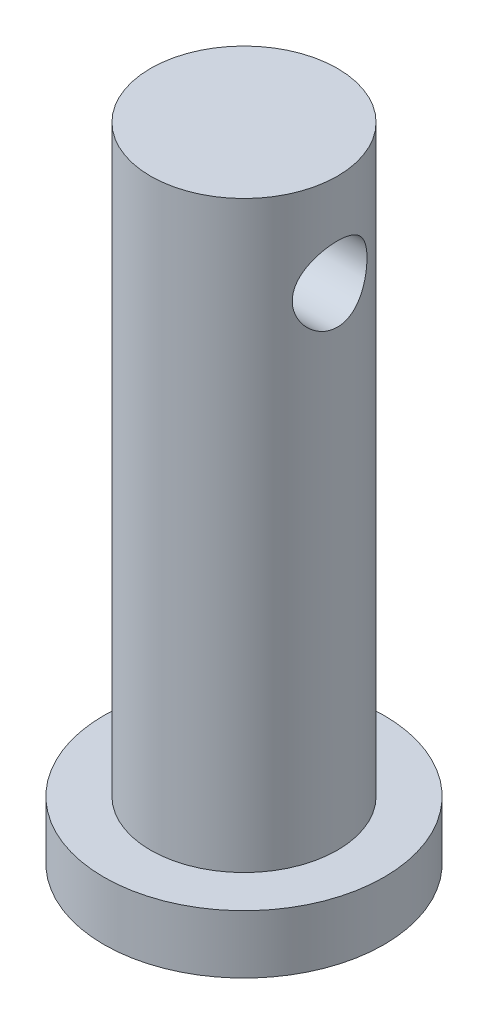
ISO-10303-21;
HEADER;
FILE_DESCRIPTION(('STEP AP214'),'2;1');
FILE_NAME('part.step','',(''),(''),'','','');
FILE_SCHEMA(('AUTOMOTIVE_DESIGN { 1 0 10303 214 1 1 1 1 }'));
ENDSEC;
DATA;
#1=APPLICATION_CONTEXT('core data for automotive mechanical design processes');
#2=APPLICATION_PROTOCOL_DEFINITION('international standard','automotive_design',2000,#1);
#3=PRODUCT_CONTEXT('',#1,'mechanical');
#4=PRODUCT('Part','Part','',(#3));
#5=PRODUCT_RELATED_PRODUCT_CATEGORY('part','',(#4));
#6=PRODUCT_DEFINITION_FORMATION('','',#4);
#7=PRODUCT_DEFINITION_CONTEXT('part definition',#1,'design');
#8=PRODUCT_DEFINITION('design','',#6,#7);
#9=PRODUCT_DEFINITION_SHAPE('','',#8);
#10=(LENGTH_UNIT() NAMED_UNIT(*) SI_UNIT(.MILLI.,.METRE.));
#11=(NAMED_UNIT(*) PLANE_ANGLE_UNIT() SI_UNIT($,.RADIAN.));
#12=(NAMED_UNIT(*) SI_UNIT($,.STERADIAN.) SOLID_ANGLE_UNIT());
#13=UNCERTAINTY_MEASURE_WITH_UNIT(LENGTH_MEASURE(1.E-05),#10,'distance_accuracy_value','');
#14=(GEOMETRIC_REPRESENTATION_CONTEXT(3) GLOBAL_UNCERTAINTY_ASSIGNED_CONTEXT((#13)) GLOBAL_UNIT_ASSIGNED_CONTEXT((#10,
#11,#12)) REPRESENTATION_CONTEXT('',''));
#15=CARTESIAN_POINT('',(0.,0.,0.));
#16=DIRECTION('',(0.,0.,1.));
#17=DIRECTION('',(1.,0.,0.));
#18=AXIS2_PLACEMENT_3D('',#15,#16,#17);
#19=CARTESIAN_POINT('',(0.,2.5,0.));
#20=DIRECTION('',(0.,-1.,0.));
#21=DIRECTION('',(0.,0.,-1.));
#22=AXIS2_PLACEMENT_3D('',#19,#20,#21);
#23=CYLINDRICAL_SURFACE('',#22,6.);
#24=CARTESIAN_POINT('',(0.,2.5,0.));
#25=DIRECTION('',(0.,1.,0.));
#26=DIRECTION('',(0.,0.,1.));
#27=AXIS2_PLACEMENT_3D('',#24,#25,#26);
#28=CIRCLE('',#27,6.);
#29=CARTESIAN_POINT('',(0.,2.5,6.));
#30=VERTEX_POINT('',#29);
#31=EDGE_CURVE('E52',#30,#30,#28,.T.);
#32=ORIENTED_EDGE('',*,*,#31,.F.);
#33=EDGE_LOOP('',(#32));
#34=FACE_BOUND('',#33,.T.);
#35=CARTESIAN_POINT('',(0.,0.,0.));
#36=DIRECTION('',(0.,1.,0.));
#37=DIRECTION('',(0.,0.,1.));
#38=AXIS2_PLACEMENT_3D('',#35,#36,#37);
#39=CIRCLE('',#38,6.);
#40=CARTESIAN_POINT('',(0.,0.,6.));
#41=VERTEX_POINT('',#40);
#42=EDGE_CURVE('E58',#41,#41,#39,.T.);
#43=ORIENTED_EDGE('',*,*,#42,.T.);
#44=EDGE_LOOP('',(#43));
#45=FACE_BOUND('',#44,.T.);
#46=ADVANCED_FACE('F39',(#34,#45),#23,.T.);
#47=CARTESIAN_POINT('',(0.,2.5,0.));
#48=DIRECTION('',(0.,1.,0.));
#49=DIRECTION('',(0.,0.,1.));
#50=AXIS2_PLACEMENT_3D('',#47,#48,#49);
#51=PLANE('',#50);
#52=CARTESIAN_POINT('',(0.,2.5,0.));
#53=DIRECTION('',(0.,1.,0.));
#54=DIRECTION('',(0.,0.,1.));
#55=AXIS2_PLACEMENT_3D('',#52,#53,#54);
#56=CIRCLE('',#55,4.);
#57=CARTESIAN_POINT('',(0.,2.5,4.));
#58=VERTEX_POINT('',#57);
#59=EDGE_CURVE('E10',#58,#58,#56,.T.);
#60=ORIENTED_EDGE('',*,*,#59,.F.);
#61=EDGE_LOOP('',(#60));
#62=FACE_BOUND('',#61,.T.);
#63=ORIENTED_EDGE('',*,*,#31,.T.);
#64=EDGE_LOOP('',(#63));
#65=FACE_BOUND('',#64,.T.);
#66=ADVANCED_FACE('F90',(#62,#65),#51,.T.);
#67=CARTESIAN_POINT('',(0.,0.,0.));
#68=DIRECTION('',(0.,1.,0.));
#69=DIRECTION('',(0.,0.,1.));
#70=AXIS2_PLACEMENT_3D('',#67,#68,#69);
#71=PLANE('',#70);
#72=ORIENTED_EDGE('',*,*,#42,.F.);
#73=EDGE_LOOP('',(#72));
#74=FACE_BOUND('',#73,.T.);
#75=ADVANCED_FACE('F86',(#74),#71,.F.);
#76=CARTESIAN_POINT('',(0.,27.5,0.));
#77=DIRECTION('',(0.,-1.,0.));
#78=DIRECTION('',(0.,0.,-1.));
#79=AXIS2_PLACEMENT_3D('',#76,#77,#78);
#80=CYLINDRICAL_SURFACE('',#79,4.);
#81=CARTESIAN_POINT('',(-3.66606055596467,23.5,-1.6));
#82=CARTESIAN_POINT('',(-3.66606921325137,23.5857115984799,-1.59999060336303));
#83=CARTESIAN_POINT('',(-3.66910881987412,23.6715444277638,-1.59307185487548));
#84=CARTESIAN_POINT('',(-3.68088731350276,23.8407478663017,-1.56565522447418));
#85=CARTESIAN_POINT('',(-3.68964076309481,23.9241116136644,-1.5451226435537));
#86=CARTESIAN_POINT('',(-3.71168364633037,24.085642353576,-1.49138802605496));
#87=CARTESIAN_POINT('',(-3.72495597085692,24.1638276378882,-1.45823372202034));
#88=CARTESIAN_POINT('',(-3.75451732076224,24.3135080406877,-1.38033621549729));
#89=CARTESIAN_POINT('',(-3.77080568723138,24.3850046153207,-1.335595543414));
#90=CARTESIAN_POINT('',(-3.80560692040826,24.5234083217932,-1.23305757966994));
#91=CARTESIAN_POINT('',(-3.82419134366997,24.5898851383436,-1.17470348618186));
#92=CARTESIAN_POINT('',(-3.86089965583049,24.7124231978523,-1.04776728461923));
#93=CARTESIAN_POINT('',(-3.87902338189098,24.7684808010319,-0.979181617340543));
#94=CARTESIAN_POINT('',(-3.91362726325484,24.8707251175862,-0.830405048285101));
#95=CARTESIAN_POINT('',(-3.93001442946855,24.9164354411765,-0.749863172489824));
#96=CARTESIAN_POINT('',(-3.95843142105237,24.9934748547118,-0.581460258300095));
#97=CARTESIAN_POINT('',(-3.97046301907739,25.0248097966256,-0.493602215430369));
#98=CARTESIAN_POINT('',(-3.98830660006628,25.0706731891499,-0.317573141471113));
#99=CARTESIAN_POINT('',(-3.99439149420286,25.0859418512712,-0.229623187843684));
#100=CARTESIAN_POINT('',(-4.00064248546163,25.1016227885302,-0.0522130629101201));
#101=CARTESIAN_POINT('',(-4.0008107901545,25.1020406047479,0.037246532660323));
#102=CARTESIAN_POINT('',(-3.99537570257429,25.08841378418,0.20978599577225));
#103=CARTESIAN_POINT('',(-3.99009597417469,25.0751801818025,0.292941962299228));
#104=CARTESIAN_POINT('',(-3.97479433175032,25.0360056989514,0.455738487374672));
#105=CARTESIAN_POINT('',(-3.9647720697689,25.0100638860797,0.535378787512128));
#106=CARTESIAN_POINT('',(-3.9407745956616,24.945890813699,0.690318350809325));
#107=CARTESIAN_POINT('',(-3.9267420837344,24.9074802281476,0.765534098703708));
#108=CARTESIAN_POINT('',(-3.89611668143758,24.8196279944648,0.90864652059246));
#109=CARTESIAN_POINT('',(-3.87952291412059,24.7701825655219,0.976540674172887));
#110=CARTESIAN_POINT('',(-3.84417309742667,24.6578806912427,1.10781506239372));
#111=CARTESIAN_POINT('',(-3.82534661216192,24.5943568859329,1.17060627621891));
#112=CARTESIAN_POINT('',(-3.78849328771823,24.4576075425432,1.28488593230826));
#113=CARTESIAN_POINT('',(-3.77046671181078,24.3843788414767,1.33637067500772));
#114=CARTESIAN_POINT('',(-3.7367751795345,24.2276647820728,1.42792335099434));
#115=CARTESIAN_POINT('',(-3.72119131345105,24.1439481356129,1.46762772138792));
#116=CARTESIAN_POINT('',(-3.69510072373859,23.9702276076304,1.53214100797301));
#117=CARTESIAN_POINT('',(-3.68459070338672,23.8802278521833,1.55695959872352));
#118=CARTESIAN_POINT('',(-3.67063807738052,23.7023713780512,1.58956395906557));
#119=CARTESIAN_POINT('',(-3.6668029315846,23.6147196423039,1.59829767744673));
#120=CARTESIAN_POINT('',(-3.66551598301679,23.4391382337856,1.60124906115921));
#121=CARTESIAN_POINT('',(-3.6680622444997,23.3512086533777,1.59547112847431));
#122=CARTESIAN_POINT('',(-3.67884835485706,23.1828328520361,1.57042631583082));
#123=CARTESIAN_POINT('',(-3.68675566238216,23.1022456500804,1.55194644961876));
#124=CARTESIAN_POINT('',(-3.70696040822297,22.9453692761712,1.50304334952902));
#125=CARTESIAN_POINT('',(-3.71925881990995,22.8690810615141,1.47261746744191));
#126=CARTESIAN_POINT('',(-3.7474702548796,22.7195181137636,1.39930851158516));
#127=CARTESIAN_POINT('',(-3.76350963711308,22.6464910490444,1.35597029461167));
#128=CARTESIAN_POINT('',(-3.7972030812627,22.5084136100467,1.2585321795535));
#129=CARTESIAN_POINT('',(-3.8148577991685,22.4433665017635,1.20442789878559));
#130=CARTESIAN_POINT('',(-3.85136732777118,22.3181012731206,1.08227536934438));
#131=CARTESIAN_POINT('',(-3.87021445828162,22.2585947477672,1.01349234355608));
#132=CARTESIAN_POINT('',(-3.9057583565405,22.1518583387117,0.866466906695073));
#133=CARTESIAN_POINT('',(-3.92245503674592,22.1046289547222,0.788224110774288));
#134=CARTESIAN_POINT('',(-3.95186972720228,22.023961898831,0.624223947201406));
#135=CARTESIAN_POINT('',(-3.96458868992219,21.9905209246674,0.53846838479525));
#136=CARTESIAN_POINT('',(-3.98458170775432,21.9387609180739,0.361914872735378));
#137=CARTESIAN_POINT('',(-3.99185871766035,21.9204336788479,0.271119688235413));
#138=CARTESIAN_POINT('',(-3.9998320656841,21.9003962386997,0.0934532082770405));
#139=CARTESIAN_POINT('',(-4.00092677395898,21.8976798972299,0.0067123940744425));
#140=CARTESIAN_POINT('',(-3.99748833902874,21.9062843834273,-0.165947068586596));
#141=CARTESIAN_POINT('',(-3.9929560477353,21.9176030862285,-0.251865839515699));
#142=CARTESIAN_POINT('',(-3.97897210691404,21.9532374306868,-0.41773672155713));
#143=CARTESIAN_POINT('',(-3.96967584507464,21.9771431568604,-0.497791043718709));
#144=CARTESIAN_POINT('',(-3.9471595826563,22.0368422436495,-0.652737883807153));
#145=CARTESIAN_POINT('',(-3.93393885843209,22.0726377968163,-0.727629446613821));
#146=CARTESIAN_POINT('',(-3.90414475488046,22.1568825587915,-0.873762433484893));
#147=CARTESIAN_POINT('',(-3.88744903782584,22.2058210359081,-0.944696309445141));
#148=CARTESIAN_POINT('',(-3.85271522549158,22.3142308153431,-1.07764322281926));
#149=CARTESIAN_POINT('',(-3.834676576404,22.3737064771681,-1.13965254859661));
#150=CARTESIAN_POINT('',(-3.79790210847538,22.50585217962,-1.25696101206879));
#151=CARTESIAN_POINT('',(-3.77919226084307,22.5791110987209,-1.31160710975922));
#152=CARTESIAN_POINT('',(-3.74439737180144,22.734353709943,-1.40787796035152));
#153=CARTESIAN_POINT('',(-3.72831263909964,22.8163384263279,-1.44950118231999));
#154=CARTESIAN_POINT('',(-3.70207091566326,22.9792297614785,-1.51519287013865));
#155=CARTESIAN_POINT('',(-3.69151134889319,23.0595721878009,-1.54050201133136));
#156=CARTESIAN_POINT('',(-3.67556802883171,23.2235883357043,-1.57817420625471));
#157=CARTESIAN_POINT('',(-3.6701698565774,23.3072520927736,-1.59057333431041));
#158=CARTESIAN_POINT('',(-3.66659567006108,23.4275020498703,-1.59877140664814));
#159=CARTESIAN_POINT('',(-3.66605689354686,23.4637401767981,-1.6000039751959));
#160=CARTESIAN_POINT('',(-3.66606055596467,23.5,-1.6));
#161=B_SPLINE_CURVE_WITH_KNOTS('',3,(#81,#82,#83,#84,#85,#86,#87,#88,#89,#90,#91,#92,#93,#94,
#95,#96,#97,#98,#99,#100,#101,#102,#103,#104,#105,#106,#107,#108,#109,#110,#111,#112,#113,#114,
#115,#116,#117,#118,#119,#120,#121,#122,#123,#124,#125,#126,#127,#128,#129,#130,#131,#132,#133,
#134,#135,#136,#137,#138,#139,#140,#141,#142,#143,#144,#145,#146,#147,#148,#149,#150,#151,#152,
#153,#154,#155,#156,#157,#158,#159,#160),.UNSPECIFIED.,.T.,.F.,(4,2,2,2,2,2,2,2,2,2,2,2,2,2,2,2,
2,2,2,2,2,2,2,2,2,2,2,2,2,2,2,2,2,2,2,2,2,2,2,4),(0.,0.257022119014121,0.514701868657797,
0.771416658634708,1.02807543059089,1.2980449462754,1.56810859478674,1.84882135273143,
2.12941973575584,2.39643346309747,2.66334756244538,2.91526915864242,3.16720924103248,
3.42294640187919,3.67877131952025,3.95139235265084,4.22410245701701,4.50451566971661,
4.78474643835289,5.04785718014745,5.3108881192156,5.55893798463324,5.80704286916518,
6.06520923717368,6.32348091615887,6.60082987392791,6.87819011877406,7.15548389845457,
7.43262700758517,7.6916883179997,7.95071041205289,8.20177595549889,8.45288782258076,
8.71509640907148,8.97741373246573,9.25597002623699,9.53455905402558,9.78813328650469,
10.040997041706,10.1497288441659),.UNSPECIFIED.);
#162=CARTESIAN_POINT('',(-3.66606055596467,23.5,-1.6));
#163=VERTEX_POINT('',#162);
#164=EDGE_CURVE('E42',#163,#163,#161,.T.);
#165=ORIENTED_EDGE('',*,*,#164,.T.);
#166=EDGE_LOOP('',(#165));
#167=FACE_BOUND('',#166,.T.);
#168=CARTESIAN_POINT('',(3.66606055596467,23.5,-1.6));
#169=CARTESIAN_POINT('',(3.66606921325137,23.4142884015201,-1.59999060336303));
#170=CARTESIAN_POINT('',(3.66910881987412,23.3284555722362,-1.59307185487548));
#171=CARTESIAN_POINT('',(3.68088731350276,23.1592521336983,-1.56565522447418));
#172=CARTESIAN_POINT('',(3.68964076309481,23.0758883863356,-1.5451226435537));
#173=CARTESIAN_POINT('',(3.71168364633037,22.914357646424,-1.49138802605496));
#174=CARTESIAN_POINT('',(3.72495597085692,22.8361723621118,-1.45823372202034));
#175=CARTESIAN_POINT('',(3.75451732076224,22.6864919593123,-1.38033621549729));
#176=CARTESIAN_POINT('',(3.77080568723138,22.6149953846793,-1.335595543414));
#177=CARTESIAN_POINT('',(3.80560692040826,22.4765916782068,-1.23305757966994));
#178=CARTESIAN_POINT('',(3.82419134366997,22.4101148616564,-1.17470348618186));
#179=CARTESIAN_POINT('',(3.86089965583049,22.2875768021477,-1.04776728461923));
#180=CARTESIAN_POINT('',(3.87902338189098,22.2315191989681,-0.979181617340543));
#181=CARTESIAN_POINT('',(3.91362726325484,22.1292748824138,-0.830405048285102));
#182=CARTESIAN_POINT('',(3.93001442946855,22.0835645588235,-0.749863172489825));
#183=CARTESIAN_POINT('',(3.95843142105237,22.0065251452882,-0.581460258300096));
#184=CARTESIAN_POINT('',(3.97046301907739,21.9751902033744,-0.493602215430369));
#185=CARTESIAN_POINT('',(3.98830660006628,21.9293268108501,-0.317573141471113));
#186=CARTESIAN_POINT('',(3.99439149420286,21.9140581487288,-0.229623187843684));
#187=CARTESIAN_POINT('',(4.00064248546163,21.8983772114698,-0.0522130629101201));
#188=CARTESIAN_POINT('',(4.0008107901545,21.8979593952521,0.037246532660323));
#189=CARTESIAN_POINT('',(3.99537570257429,21.91158621582,0.20978599577225));
#190=CARTESIAN_POINT('',(3.99009597417469,21.9248198181975,0.292941962299228));
#191=CARTESIAN_POINT('',(3.97479433175032,21.9639943010486,0.455738487374672));
#192=CARTESIAN_POINT('',(3.9647720697689,21.9899361139203,0.535378787512128));
#193=CARTESIAN_POINT('',(3.9407745956616,22.054109186301,0.690318350809326));
#194=CARTESIAN_POINT('',(3.9267420837344,22.0925197718524,0.765534098703708));
#195=CARTESIAN_POINT('',(3.89611668143758,22.1803720055352,0.90864652059246));
#196=CARTESIAN_POINT('',(3.87952291412059,22.2298174344781,0.976540674172888));
#197=CARTESIAN_POINT('',(3.84417309742667,22.3421193087573,1.10781506239372));
#198=CARTESIAN_POINT('',(3.82534661216192,22.4056431140671,1.17060627621891));
#199=CARTESIAN_POINT('',(3.78849328771823,22.5423924574568,1.28488593230826));
#200=CARTESIAN_POINT('',(3.77046671181078,22.6156211585233,1.33637067500773));
#201=CARTESIAN_POINT('',(3.7367751795345,22.7723352179272,1.42792335099435));
#202=CARTESIAN_POINT('',(3.72119131345105,22.8560518643871,1.46762772138792));
#203=CARTESIAN_POINT('',(3.69510072373859,23.0297723923696,1.53214100797301));
#204=CARTESIAN_POINT('',(3.68459070338672,23.1197721478167,1.55695959872352));
#205=CARTESIAN_POINT('',(3.67063807738052,23.2976286219488,1.58956395906557));
#206=CARTESIAN_POINT('',(3.6668029315846,23.3852803576961,1.59829767744673));
#207=CARTESIAN_POINT('',(3.66551598301679,23.5608617662144,1.60124906115921));
#208=CARTESIAN_POINT('',(3.6680622444997,23.6487913466223,1.59547112847431));
#209=CARTESIAN_POINT('',(3.67884835485706,23.8171671479639,1.57042631583082));
#210=CARTESIAN_POINT('',(3.68675566238216,23.8977543499196,1.55194644961876));
#211=CARTESIAN_POINT('',(3.70696040822297,24.0546307238288,1.50304334952902));
#212=CARTESIAN_POINT('',(3.71925881990995,24.1309189384859,1.47261746744191));
#213=CARTESIAN_POINT('',(3.7474702548796,24.2804818862364,1.39930851158516));
#214=CARTESIAN_POINT('',(3.76350963711308,24.3535089509556,1.35597029461167));
#215=CARTESIAN_POINT('',(3.7972030812627,24.4915863899533,1.2585321795535));
#216=CARTESIAN_POINT('',(3.8148577991685,24.5566334982365,1.20442789878558));
#217=CARTESIAN_POINT('',(3.85136732777118,24.6818987268794,1.08227536934438));
#218=CARTESIAN_POINT('',(3.87021445828162,24.7414052522328,1.01349234355608));
#219=CARTESIAN_POINT('',(3.9057583565405,24.8481416612883,0.866466906695073));
#220=CARTESIAN_POINT('',(3.92245503674592,24.8953710452778,0.788224110774288));
#221=CARTESIAN_POINT('',(3.95186972720228,24.976038101169,0.624223947201406));
#222=CARTESIAN_POINT('',(3.96458868992219,25.0094790753326,0.53846838479525));
#223=CARTESIAN_POINT('',(3.98458170775432,25.0612390819261,0.361914872735378));
#224=CARTESIAN_POINT('',(3.99185871766035,25.0795663211521,0.271119688235414));
#225=CARTESIAN_POINT('',(3.9998320656841,25.0996037613003,0.0934532082770406));
#226=CARTESIAN_POINT('',(4.00092677395898,25.1023201027701,0.00671239407444235));
#227=CARTESIAN_POINT('',(3.99748833902874,25.0937156165727,-0.165947068586597));
#228=CARTESIAN_POINT('',(3.9929560477353,25.0823969137715,-0.251865839515699));
#229=CARTESIAN_POINT('',(3.97897210691404,25.0467625693132,-0.417736721557131));
#230=CARTESIAN_POINT('',(3.96967584507464,25.0228568431396,-0.49779104371871));
#231=CARTESIAN_POINT('',(3.9471595826563,24.9631577563505,-0.652737883807154));
#232=CARTESIAN_POINT('',(3.93393885843209,24.9273622031837,-0.727629446613822));
#233=CARTESIAN_POINT('',(3.90414475488046,24.8431174412085,-0.873762433484893));
#234=CARTESIAN_POINT('',(3.88744903782584,24.7941789640919,-0.944696309445142));
#235=CARTESIAN_POINT('',(3.85271522549158,24.6857691846569,-1.07764322281926));
#236=CARTESIAN_POINT('',(3.834676576404,24.6262935228319,-1.13965254859661));
#237=CARTESIAN_POINT('',(3.79790210847538,24.49414782038,-1.25696101206879));
#238=CARTESIAN_POINT('',(3.77919226084307,24.4208889012791,-1.31160710975922));
#239=CARTESIAN_POINT('',(3.74439737180144,24.265646290057,-1.40787796035152));
#240=CARTESIAN_POINT('',(3.72831263909964,24.1836615736721,-1.44950118231999));
#241=CARTESIAN_POINT('',(3.70207091566326,24.0207702385215,-1.51519287013865));
#242=CARTESIAN_POINT('',(3.69151134889319,23.9404278121991,-1.54050201133137));
#243=CARTESIAN_POINT('',(3.67556802883171,23.7764116642957,-1.57817420625471));
#244=CARTESIAN_POINT('',(3.6701698565774,23.6927479072264,-1.59057333431041));
#245=CARTESIAN_POINT('',(3.66659567006108,23.5724979501297,-1.59877140664814));
#246=CARTESIAN_POINT('',(3.66605689354686,23.5362598232019,-1.6000039751959));
#247=CARTESIAN_POINT('',(3.66606055596467,23.5,-1.6));
#248=B_SPLINE_CURVE_WITH_KNOTS('',3,(#168,#169,#170,#171,#172,#173,#174,#175,#176,#177,#178,
#179,#180,#181,#182,#183,#184,#185,#186,#187,#188,#189,#190,#191,#192,#193,#194,#195,#196,#197,
#198,#199,#200,#201,#202,#203,#204,#205,#206,#207,#208,#209,#210,#211,#212,#213,#214,#215,#216,
#217,#218,#219,#220,#221,#222,#223,#224,#225,#226,#227,#228,#229,#230,#231,#232,#233,#234,#235,
#236,#237,#238,#239,#240,#241,#242,#243,#244,#245,#246,#247),.UNSPECIFIED.,.T.,.F.,(4,2,2,2,2,2,
2,2,2,2,2,2,2,2,2,2,2,2,2,2,2,2,2,2,2,2,2,2,2,2,2,2,2,2,2,2,2,2,2,4),(0.,0.257022119014121,
0.514701868657797,0.771416658634708,1.02807543059089,1.2980449462754,1.56810859478674,
1.84882135273142,2.12941973575584,2.39643346309747,2.66334756244538,2.91526915864242,
3.16720924103248,3.42294640187919,3.67877131952025,3.95139235265084,4.22410245701702,
4.50451566971661,4.78474643835289,5.04785718014745,5.3108881192156,5.55893798463324,
5.80704286916518,6.06520923717368,6.32348091615887,6.60082987392791,6.87819011877406,
7.15548389845457,7.43262700758517,7.6916883179997,7.95071041205289,8.20177595549889,
8.45288782258076,8.71509640907148,8.97741373246572,9.25597002623698,9.53455905402558,
9.78813328650469,10.040997041706,10.1497288441659),.UNSPECIFIED.);
#249=CARTESIAN_POINT('',(3.66606055596467,23.5,-1.6));
#250=VERTEX_POINT('',#249);
#251=EDGE_CURVE('E65',#250,#250,#248,.T.);
#252=ORIENTED_EDGE('',*,*,#251,.T.);
#253=EDGE_LOOP('',(#252));
#254=FACE_BOUND('',#253,.T.);
#255=CARTESIAN_POINT('',(0.,27.5,0.));
#256=DIRECTION('',(0.,1.,0.));
#257=DIRECTION('',(0.,0.,1.));
#258=AXIS2_PLACEMENT_3D('',#255,#256,#257);
#259=CIRCLE('',#258,4.);
#260=CARTESIAN_POINT('',(0.,27.5,4.));
#261=VERTEX_POINT('',#260);
#262=EDGE_CURVE('E61',#261,#261,#259,.T.);
#263=ORIENTED_EDGE('',*,*,#262,.F.);
#264=EDGE_LOOP('',(#263));
#265=FACE_BOUND('',#264,.T.);
#266=ORIENTED_EDGE('',*,*,#59,.T.);
#267=EDGE_LOOP('',(#266));
#268=FACE_BOUND('',#267,.T.);
#269=ADVANCED_FACE('F71',(#167,#254,#265,#268),#80,.T.);
#270=CARTESIAN_POINT('',(0.,27.5,0.));
#271=DIRECTION('',(0.,1.,0.));
#272=DIRECTION('',(0.,0.,1.));
#273=AXIS2_PLACEMENT_3D('',#270,#271,#272);
#274=PLANE('',#273);
#275=ORIENTED_EDGE('',*,*,#262,.T.);
#276=EDGE_LOOP('',(#275));
#277=FACE_BOUND('',#276,.T.);
#278=ADVANCED_FACE('F78',(#277),#274,.T.);
#279=CARTESIAN_POINT('',(-6.,23.5,0.));
#280=DIRECTION('',(1.,0.,0.));
#281=DIRECTION('',(0.,0.,-1.));
#282=AXIS2_PLACEMENT_3D('',#279,#280,#281);
#283=CYLINDRICAL_SURFACE('',#282,1.6);
#284=ORIENTED_EDGE('',*,*,#251,.F.);
#285=EDGE_LOOP('',(#284));
#286=FACE_BOUND('',#285,.T.);
#287=ORIENTED_EDGE('',*,*,#164,.F.);
#288=EDGE_LOOP('',(#287));
#289=FACE_BOUND('',#288,.T.);
#290=ADVANCED_FACE('F75',(#286,#289),#283,.F.);
#291=CLOSED_SHELL('',(#46,#66,#75,#269,#278,#290));
#292=MANIFOLD_SOLID_BREP('B2',#291);
#293=ADVANCED_BREP_SHAPE_REPRESENTATION('',(#18,#292),#14);
#294=SHAPE_DEFINITION_REPRESENTATION(#9,#293);
ENDSEC;
END-ISO-10303-21;
